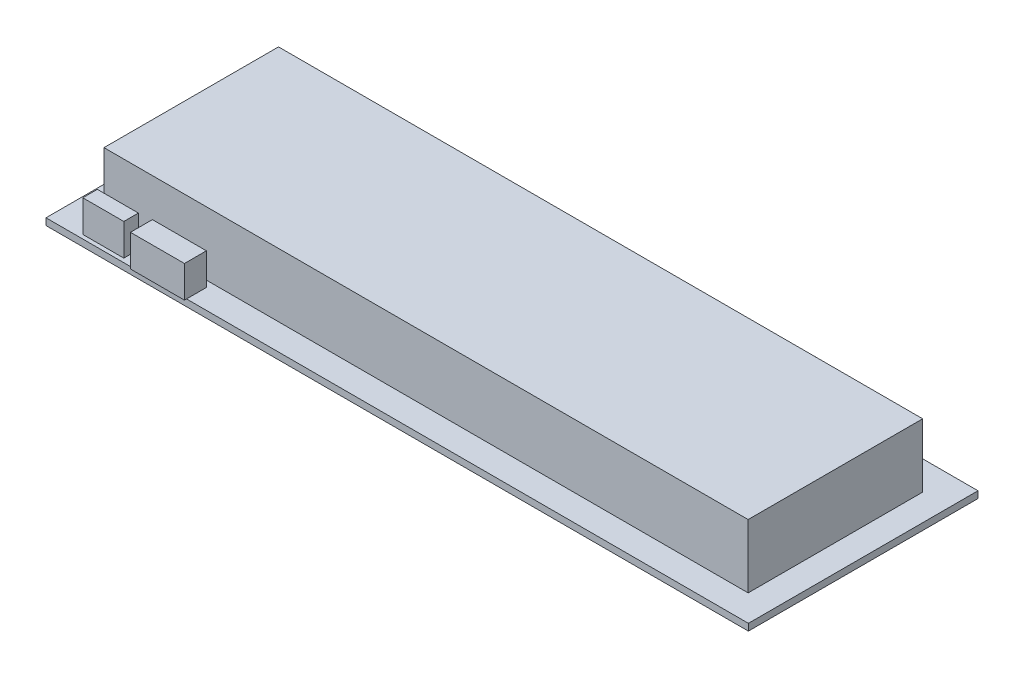
ISO-10303-21;
HEADER;
FILE_DESCRIPTION(('STEP AP214'),'2;1');
FILE_NAME('part.step','',(''),(''),'','','');
FILE_SCHEMA(('AUTOMOTIVE_DESIGN { 1 0 10303 214 1 1 1 1 }'));
ENDSEC;
DATA;
#1=APPLICATION_CONTEXT('core data for automotive mechanical design processes');
#2=APPLICATION_PROTOCOL_DEFINITION('international standard','automotive_design',2000,#1);
#3=PRODUCT_CONTEXT('',#1,'mechanical');
#4=PRODUCT('Part','Part','',(#3));
#5=PRODUCT_RELATED_PRODUCT_CATEGORY('part','',(#4));
#6=PRODUCT_DEFINITION_FORMATION('','',#4);
#7=PRODUCT_DEFINITION_CONTEXT('part definition',#1,'design');
#8=PRODUCT_DEFINITION('design','',#6,#7);
#9=PRODUCT_DEFINITION_SHAPE('','',#8);
#10=(LENGTH_UNIT() NAMED_UNIT(*) SI_UNIT(.MILLI.,.METRE.));
#11=(NAMED_UNIT(*) PLANE_ANGLE_UNIT() SI_UNIT($,.RADIAN.));
#12=(NAMED_UNIT(*) SI_UNIT($,.STERADIAN.) SOLID_ANGLE_UNIT());
#13=UNCERTAINTY_MEASURE_WITH_UNIT(LENGTH_MEASURE(1.E-05),#10,'distance_accuracy_value','');
#14=(GEOMETRIC_REPRESENTATION_CONTEXT(3) GLOBAL_UNCERTAINTY_ASSIGNED_CONTEXT((#13)) GLOBAL_UNIT_ASSIGNED_CONTEXT((#10,
#11,#12)) REPRESENTATION_CONTEXT('',''));
#15=CARTESIAN_POINT('',(0.,0.,0.));
#16=DIRECTION('',(0.,0.,1.));
#17=DIRECTION('',(1.,0.,0.));
#18=AXIS2_PLACEMENT_3D('',#15,#16,#17);
#19=CARTESIAN_POINT('',(0.,2.56,0.));
#20=DIRECTION('',(0.,-1.,0.));
#21=DIRECTION('',(0.,0.,-1.));
#22=AXIS2_PLACEMENT_3D('',#19,#20,#21);
#23=PLANE('',#22);
#24=DIRECTION('',(0.,0.,1.));
#25=VECTOR('',#24,1.);
#26=CARTESIAN_POINT('',(12.4,2.56,-1.5));
#27=LINE('',#26,#25);
#28=CARTESIAN_POINT('',(12.4,2.56,-7.));
#29=VERTEX_POINT('',#28);
#30=CARTESIAN_POINT('',(12.4,2.56,-1.5));
#31=VERTEX_POINT('',#30);
#32=EDGE_CURVE('E176',#29,#31,#27,.T.);
#33=ORIENTED_EDGE('',*,*,#32,.F.);
#34=DIRECTION('',(-1.,0.,0.));
#35=VECTOR('',#34,1.);
#36=CARTESIAN_POINT('',(12.4,2.56,-7.));
#37=LINE('',#36,#35);
#38=CARTESIAN_POINT('',(27.9,2.56,-7.));
#39=VERTEX_POINT('',#38);
#40=EDGE_CURVE('E189',#39,#29,#37,.T.);
#41=ORIENTED_EDGE('',*,*,#40,.F.);
#42=DIRECTION('',(0.,0.,-1.));
#43=VECTOR('',#42,1.);
#44=CARTESIAN_POINT('',(27.9,2.56,-1.5));
#45=LINE('',#44,#43);
#46=CARTESIAN_POINT('',(27.9,2.56,-1.5));
#47=VERTEX_POINT('',#46);
#48=EDGE_CURVE('E198',#47,#39,#45,.T.);
#49=ORIENTED_EDGE('',*,*,#48,.F.);
#50=DIRECTION('',(1.,0.,0.));
#51=VECTOR('',#50,1.);
#52=CARTESIAN_POINT('',(12.4,2.56,-1.5));
#53=LINE('',#52,#51);
#54=EDGE_CURVE('E179',#31,#47,#53,.T.);
#55=ORIENTED_EDGE('',*,*,#54,.F.);
#56=EDGE_LOOP('',(#33,#41,#49,#55));
#57=FACE_BOUND('',#56,.T.);
#58=DIRECTION('',(0.,0.,1.));
#59=VECTOR('',#58,1.);
#60=CARTESIAN_POINT('',(12.,2.56,-9.9));
#61=LINE('',#60,#59);
#62=CARTESIAN_POINT('',(12.,2.56,-75.84));
#63=VERTEX_POINT('',#62);
#64=CARTESIAN_POINT('',(12.,2.56,-9.9));
#65=VERTEX_POINT('',#64);
#66=EDGE_CURVE('E214',#63,#65,#61,.T.);
#67=ORIENTED_EDGE('',*,*,#66,.F.);
#68=DIRECTION('',(-1.,0.,0.));
#69=VECTOR('',#68,1.);
#70=CARTESIAN_POINT('',(12.,2.56,-75.84));
#71=LINE('',#70,#69);
#72=CARTESIAN_POINT('',(255.36,2.56,-75.84));
#73=VERTEX_POINT('',#72);
#74=EDGE_CURVE('E219',#73,#63,#71,.T.);
#75=ORIENTED_EDGE('',*,*,#74,.F.);
#76=DIRECTION('',(0.,0.,-1.));
#77=VECTOR('',#76,1.);
#78=CARTESIAN_POINT('',(255.36,2.56,-9.9));
#79=LINE('',#78,#77);
#80=CARTESIAN_POINT('',(255.36,2.56,-9.9));
#81=VERTEX_POINT('',#80);
#82=EDGE_CURVE('E231',#81,#73,#79,.T.);
#83=ORIENTED_EDGE('',*,*,#82,.F.);
#84=DIRECTION('',(1.,0.,0.));
#85=VECTOR('',#84,1.);
#86=CARTESIAN_POINT('',(12.,2.56,-9.9));
#87=LINE('',#86,#85);
#88=EDGE_CURVE('E228',#65,#81,#87,.T.);
#89=ORIENTED_EDGE('',*,*,#88,.F.);
#90=EDGE_LOOP('',(#67,#75,#83,#89));
#91=FACE_BOUND('',#90,.T.);
#92=DIRECTION('',(0.,0.,1.));
#93=VECTOR('',#92,1.);
#94=CARTESIAN_POINT('',(32.7,2.56,-7.5));
#95=LINE('',#94,#93);
#96=CARTESIAN_POINT('',(32.7,2.56,-7.5));
#97=VERTEX_POINT('',#96);
#98=CARTESIAN_POINT('',(32.7,2.56,0.));
#99=VERTEX_POINT('',#98);
#100=EDGE_CURVE('E48',#97,#99,#95,.T.);
#101=ORIENTED_EDGE('',*,*,#100,.F.);
#102=DIRECTION('',(-1.,0.,0.));
#103=VECTOR('',#102,1.);
#104=CARTESIAN_POINT('',(32.7,2.56,-7.5));
#105=LINE('',#104,#103);
#106=CARTESIAN_POINT('',(53.1,2.56,-7.5));
#107=VERTEX_POINT('',#106);
#108=EDGE_CURVE('E52',#107,#97,#105,.T.);
#109=ORIENTED_EDGE('',*,*,#108,.F.);
#110=DIRECTION('',(0.,0.,-1.));
#111=VECTOR('',#110,1.);
#112=CARTESIAN_POINT('',(53.1,2.56,-7.5));
#113=LINE('',#112,#111);
#114=CARTESIAN_POINT('',(53.1,2.56,0.));
#115=VERTEX_POINT('',#114);
#116=EDGE_CURVE('E291',#115,#107,#113,.T.);
#117=ORIENTED_EDGE('',*,*,#116,.F.);
#118=DIRECTION('',(1.,0.,0.));
#119=VECTOR('',#118,1.);
#120=CARTESIAN_POINT('',(0.,2.56,0.));
#121=LINE('',#120,#119);
#122=CARTESIAN_POINT('',(265.36,2.56,0.));
#123=VERTEX_POINT('',#122);
#124=EDGE_CURVE('E251',#115,#123,#121,.T.);
#125=ORIENTED_EDGE('',*,*,#124,.T.);
#126=DIRECTION('',(0.,0.,-1.));
#127=VECTOR('',#126,1.);
#128=CARTESIAN_POINT('',(265.36,2.56,0.));
#129=LINE('',#128,#127);
#130=CARTESIAN_POINT('',(265.36,2.56,-86.74));
#131=VERTEX_POINT('',#130);
#132=EDGE_CURVE('E255',#123,#131,#129,.T.);
#133=ORIENTED_EDGE('',*,*,#132,.T.);
#134=DIRECTION('',(-1.,0.,0.));
#135=VECTOR('',#134,1.);
#136=CARTESIAN_POINT('',(0.,2.56,-86.74));
#137=LINE('',#136,#135);
#138=CARTESIAN_POINT('',(0.,2.56,-86.74));
#139=VERTEX_POINT('',#138);
#140=EDGE_CURVE('E258',#131,#139,#137,.T.);
#141=ORIENTED_EDGE('',*,*,#140,.T.);
#142=DIRECTION('',(0.,0.,1.));
#143=VECTOR('',#142,1.);
#144=CARTESIAN_POINT('',(0.,2.56,0.));
#145=LINE('',#144,#143);
#146=CARTESIAN_POINT('',(0.,2.56,0.));
#147=VERTEX_POINT('',#146);
#148=EDGE_CURVE('E248',#139,#147,#145,.T.);
#149=ORIENTED_EDGE('',*,*,#148,.T.);
#150=EDGE_CURVE('E253',#147,#99,#121,.T.);
#151=ORIENTED_EDGE('',*,*,#150,.T.);
#152=EDGE_LOOP('',(#101,#109,#117,#125,#133,#141,#149,#151));
#153=FACE_BOUND('',#152,.T.);
#154=ADVANCED_FACE('F33',(#57,#91,#153),#23,.F.);
#155=CARTESIAN_POINT('',(0.,2.56,0.));
#156=DIRECTION('',(1.,0.,0.));
#157=DIRECTION('',(0.,0.,-1.));
#158=AXIS2_PLACEMENT_3D('',#155,#156,#157);
#159=PLANE('',#158);
#160=DIRECTION('',(0.,0.,1.));
#161=VECTOR('',#160,1.);
#162=CARTESIAN_POINT('',(0.,0.,0.));
#163=LINE('',#162,#161);
#164=CARTESIAN_POINT('',(0.,0.,-86.74));
#165=VERTEX_POINT('',#164);
#166=CARTESIAN_POINT('',(0.,0.,0.));
#167=VERTEX_POINT('',#166);
#168=EDGE_CURVE('E247',#165,#167,#163,.T.);
#169=ORIENTED_EDGE('',*,*,#168,.T.);
#170=DIRECTION('',(0.,-1.,0.));
#171=VECTOR('',#170,1.);
#172=CARTESIAN_POINT('',(0.,2.56,0.));
#173=LINE('',#172,#171);
#174=EDGE_CURVE('E11',#147,#167,#173,.T.);
#175=ORIENTED_EDGE('',*,*,#174,.F.);
#176=ORIENTED_EDGE('',*,*,#148,.F.);
#177=DIRECTION('',(0.,-1.,0.));
#178=VECTOR('',#177,1.);
#179=CARTESIAN_POINT('',(0.,2.56,-86.74));
#180=LINE('',#179,#178);
#181=EDGE_CURVE('E260',#139,#165,#180,.T.);
#182=ORIENTED_EDGE('',*,*,#181,.T.);
#183=EDGE_LOOP('',(#169,#175,#176,#182));
#184=FACE_BOUND('',#183,.T.);
#185=ADVANCED_FACE('F35',(#184),#159,.F.);
#186=CARTESIAN_POINT('',(0.,2.56,0.));
#187=DIRECTION('',(0.,0.,-1.));
#188=DIRECTION('',(-1.,0.,0.));
#189=AXIS2_PLACEMENT_3D('',#186,#187,#188);
#190=PLANE('',#189);
#191=DIRECTION('',(1.,0.,0.));
#192=VECTOR('',#191,1.);
#193=CARTESIAN_POINT('',(0.,0.,0.));
#194=LINE('',#193,#192);
#195=CARTESIAN_POINT('',(265.36,0.,0.));
#196=VERTEX_POINT('',#195);
#197=EDGE_CURVE('E263',#167,#196,#194,.T.);
#198=ORIENTED_EDGE('',*,*,#197,.T.);
#199=DIRECTION('',(0.,-1.,0.));
#200=VECTOR('',#199,1.);
#201=CARTESIAN_POINT('',(265.36,2.56,0.));
#202=LINE('',#201,#200);
#203=EDGE_CURVE('E41',#123,#196,#202,.T.);
#204=ORIENTED_EDGE('',*,*,#203,.F.);
#205=ORIENTED_EDGE('',*,*,#124,.F.);
#206=EDGE_CURVE('E256',#99,#115,#121,.T.);
#207=ORIENTED_EDGE('',*,*,#206,.F.);
#208=ORIENTED_EDGE('',*,*,#150,.F.);
#209=ORIENTED_EDGE('',*,*,#174,.T.);
#210=EDGE_LOOP('',(#198,#204,#205,#207,#208,#209));
#211=FACE_BOUND('',#210,.T.);
#212=ADVANCED_FACE('F328',(#211),#190,.F.);
#213=CARTESIAN_POINT('',(265.36,2.56,0.));
#214=DIRECTION('',(-1.,0.,0.));
#215=DIRECTION('',(0.,0.,1.));
#216=AXIS2_PLACEMENT_3D('',#213,#214,#215);
#217=PLANE('',#216);
#218=DIRECTION('',(0.,0.,-1.));
#219=VECTOR('',#218,1.);
#220=CARTESIAN_POINT('',(265.36,0.,0.));
#221=LINE('',#220,#219);
#222=CARTESIAN_POINT('',(265.36,0.,-86.74));
#223=VERTEX_POINT('',#222);
#224=EDGE_CURVE('E265',#196,#223,#221,.T.);
#225=ORIENTED_EDGE('',*,*,#224,.T.);
#226=DIRECTION('',(0.,-1.,0.));
#227=VECTOR('',#226,1.);
#228=CARTESIAN_POINT('',(265.36,2.56,-86.74));
#229=LINE('',#228,#227);
#230=EDGE_CURVE('E270',#131,#223,#229,.T.);
#231=ORIENTED_EDGE('',*,*,#230,.F.);
#232=ORIENTED_EDGE('',*,*,#132,.F.);
#233=ORIENTED_EDGE('',*,*,#203,.T.);
#234=EDGE_LOOP('',(#225,#231,#232,#233));
#235=FACE_BOUND('',#234,.T.);
#236=ADVANCED_FACE('F277',(#235),#217,.F.);
#237=CARTESIAN_POINT('',(0.,2.56,-86.74));
#238=DIRECTION('',(0.,0.,1.));
#239=DIRECTION('',(1.,0.,0.));
#240=AXIS2_PLACEMENT_3D('',#237,#238,#239);
#241=PLANE('',#240);
#242=DIRECTION('',(-1.,0.,0.));
#243=VECTOR('',#242,1.);
#244=CARTESIAN_POINT('',(0.,0.,-86.74));
#245=LINE('',#244,#243);
#246=EDGE_CURVE('E252',#223,#165,#245,.T.);
#247=ORIENTED_EDGE('',*,*,#246,.T.);
#248=ORIENTED_EDGE('',*,*,#181,.F.);
#249=ORIENTED_EDGE('',*,*,#140,.F.);
#250=ORIENTED_EDGE('',*,*,#230,.T.);
#251=EDGE_LOOP('',(#247,#248,#249,#250));
#252=FACE_BOUND('',#251,.T.);
#253=ADVANCED_FACE('F286',(#252),#241,.F.);
#254=CARTESIAN_POINT('',(0.,0.,0.));
#255=DIRECTION('',(0.,-1.,0.));
#256=DIRECTION('',(0.,0.,-1.));
#257=AXIS2_PLACEMENT_3D('',#254,#255,#256);
#258=PLANE('',#257);
#259=ORIENTED_EDGE('',*,*,#168,.F.);
#260=ORIENTED_EDGE('',*,*,#246,.F.);
#261=ORIENTED_EDGE('',*,*,#224,.F.);
#262=ORIENTED_EDGE('',*,*,#197,.F.);
#263=EDGE_LOOP('',(#259,#260,#261,#262));
#264=FACE_BOUND('',#263,.T.);
#265=ADVANCED_FACE('F283',(#264),#258,.T.);
#266=CARTESIAN_POINT('',(12.,26.56,-9.9));
#267=DIRECTION('',(1.,0.,0.));
#268=DIRECTION('',(0.,0.,-1.));
#269=AXIS2_PLACEMENT_3D('',#266,#267,#268);
#270=PLANE('',#269);
#271=ORIENTED_EDGE('',*,*,#66,.T.);
#272=DIRECTION('',(0.,-1.,0.));
#273=VECTOR('',#272,1.);
#274=CARTESIAN_POINT('',(12.,26.56,-9.9));
#275=LINE('',#274,#273);
#276=CARTESIAN_POINT('',(12.,26.56,-9.9));
#277=VERTEX_POINT('',#276);
#278=EDGE_CURVE('E244',#277,#65,#275,.T.);
#279=ORIENTED_EDGE('',*,*,#278,.F.);
#280=DIRECTION('',(0.,0.,1.));
#281=VECTOR('',#280,1.);
#282=CARTESIAN_POINT('',(12.,26.56,-9.9));
#283=LINE('',#282,#281);
#284=CARTESIAN_POINT('',(12.,26.56,-75.84));
#285=VERTEX_POINT('',#284);
#286=EDGE_CURVE('E215',#285,#277,#283,.T.);
#287=ORIENTED_EDGE('',*,*,#286,.F.);
#288=DIRECTION('',(0.,-1.,0.));
#289=VECTOR('',#288,1.);
#290=CARTESIAN_POINT('',(12.,26.56,-75.84));
#291=LINE('',#290,#289);
#292=EDGE_CURVE('E225',#285,#63,#291,.T.);
#293=ORIENTED_EDGE('',*,*,#292,.T.);
#294=EDGE_LOOP('',(#271,#279,#287,#293));
#295=FACE_BOUND('',#294,.T.);
#296=ADVANCED_FACE('F332',(#295),#270,.F.);
#297=CARTESIAN_POINT('',(12.,26.56,-9.9));
#298=DIRECTION('',(0.,0.,-1.));
#299=DIRECTION('',(-1.,0.,0.));
#300=AXIS2_PLACEMENT_3D('',#297,#298,#299);
#301=PLANE('',#300);
#302=ORIENTED_EDGE('',*,*,#88,.T.);
#303=DIRECTION('',(0.,-1.,0.));
#304=VECTOR('',#303,1.);
#305=CARTESIAN_POINT('',(255.36,26.56,-9.9));
#306=LINE('',#305,#304);
#307=CARTESIAN_POINT('',(255.36,26.56,-9.9));
#308=VERTEX_POINT('',#307);
#309=EDGE_CURVE('E241',#308,#81,#306,.T.);
#310=ORIENTED_EDGE('',*,*,#309,.F.);
#311=DIRECTION('',(1.,0.,0.));
#312=VECTOR('',#311,1.);
#313=CARTESIAN_POINT('',(12.,26.56,-9.9));
#314=LINE('',#313,#312);
#315=EDGE_CURVE('E218',#277,#308,#314,.T.);
#316=ORIENTED_EDGE('',*,*,#315,.F.);
#317=ORIENTED_EDGE('',*,*,#278,.T.);
#318=EDGE_LOOP('',(#302,#310,#316,#317));
#319=FACE_BOUND('',#318,.T.);
#320=ADVANCED_FACE('F363',(#319),#301,.F.);
#321=CARTESIAN_POINT('',(255.36,26.56,-9.9));
#322=DIRECTION('',(-1.,0.,0.));
#323=DIRECTION('',(0.,0.,1.));
#324=AXIS2_PLACEMENT_3D('',#321,#322,#323);
#325=PLANE('',#324);
#326=ORIENTED_EDGE('',*,*,#82,.T.);
#327=DIRECTION('',(0.,-1.,0.));
#328=VECTOR('',#327,1.);
#329=CARTESIAN_POINT('',(255.36,26.56,-75.84));
#330=LINE('',#329,#328);
#331=CARTESIAN_POINT('',(255.36,26.56,-75.84));
#332=VERTEX_POINT('',#331);
#333=EDGE_CURVE('E238',#332,#73,#330,.T.);
#334=ORIENTED_EDGE('',*,*,#333,.F.);
#335=DIRECTION('',(0.,0.,-1.));
#336=VECTOR('',#335,1.);
#337=CARTESIAN_POINT('',(255.36,26.56,-9.9));
#338=LINE('',#337,#336);
#339=EDGE_CURVE('E221',#308,#332,#338,.T.);
#340=ORIENTED_EDGE('',*,*,#339,.F.);
#341=ORIENTED_EDGE('',*,*,#309,.T.);
#342=EDGE_LOOP('',(#326,#334,#340,#341));
#343=FACE_BOUND('',#342,.T.);
#344=ADVANCED_FACE('F370',(#343),#325,.F.);
#345=CARTESIAN_POINT('',(12.,26.56,-75.84));
#346=DIRECTION('',(0.,0.,1.));
#347=DIRECTION('',(1.,0.,0.));
#348=AXIS2_PLACEMENT_3D('',#345,#346,#347);
#349=PLANE('',#348);
#350=ORIENTED_EDGE('',*,*,#74,.T.);
#351=ORIENTED_EDGE('',*,*,#292,.F.);
#352=DIRECTION('',(-1.,0.,0.));
#353=VECTOR('',#352,1.);
#354=CARTESIAN_POINT('',(12.,26.56,-75.84));
#355=LINE('',#354,#353);
#356=EDGE_CURVE('E223',#332,#285,#355,.T.);
#357=ORIENTED_EDGE('',*,*,#356,.F.);
#358=ORIENTED_EDGE('',*,*,#333,.T.);
#359=EDGE_LOOP('',(#350,#351,#357,#358));
#360=FACE_BOUND('',#359,.T.);
#361=ADVANCED_FACE('F377',(#360),#349,.F.);
#362=CARTESIAN_POINT('',(0.,26.56,0.));
#363=DIRECTION('',(0.,-1.,0.));
#364=DIRECTION('',(0.,0.,-1.));
#365=AXIS2_PLACEMENT_3D('',#362,#363,#364);
#366=PLANE('',#365);
#367=ORIENTED_EDGE('',*,*,#286,.T.);
#368=ORIENTED_EDGE('',*,*,#315,.T.);
#369=ORIENTED_EDGE('',*,*,#339,.T.);
#370=ORIENTED_EDGE('',*,*,#356,.T.);
#371=EDGE_LOOP('',(#367,#368,#369,#370));
#372=FACE_BOUND('',#371,.T.);
#373=ADVANCED_FACE('F385',(#372),#366,.F.);
#374=CARTESIAN_POINT('',(12.4,14.56,-1.5));
#375=DIRECTION('',(1.,0.,0.));
#376=DIRECTION('',(0.,0.,-1.));
#377=AXIS2_PLACEMENT_3D('',#374,#375,#376);
#378=PLANE('',#377);
#379=ORIENTED_EDGE('',*,*,#32,.T.);
#380=DIRECTION('',(0.,-1.,0.));
#381=VECTOR('',#380,1.);
#382=CARTESIAN_POINT('',(12.4,14.56,-1.5));
#383=LINE('',#382,#381);
#384=CARTESIAN_POINT('',(12.4,14.56,-1.5));
#385=VERTEX_POINT('',#384);
#386=EDGE_CURVE('E211',#385,#31,#383,.T.);
#387=ORIENTED_EDGE('',*,*,#386,.F.);
#388=DIRECTION('',(0.,0.,1.));
#389=VECTOR('',#388,1.);
#390=CARTESIAN_POINT('',(12.4,14.56,-1.5));
#391=LINE('',#390,#389);
#392=CARTESIAN_POINT('',(12.4,14.56,-7.));
#393=VERTEX_POINT('',#392);
#394=EDGE_CURVE('E185',#393,#385,#391,.T.);
#395=ORIENTED_EDGE('',*,*,#394,.F.);
#396=DIRECTION('',(0.,-1.,0.));
#397=VECTOR('',#396,1.);
#398=CARTESIAN_POINT('',(12.4,14.56,-7.));
#399=LINE('',#398,#397);
#400=EDGE_CURVE('E194',#393,#29,#399,.T.);
#401=ORIENTED_EDGE('',*,*,#400,.T.);
#402=EDGE_LOOP('',(#379,#387,#395,#401));
#403=FACE_BOUND('',#402,.T.);
#404=ADVANCED_FACE('F393',(#403),#378,.F.);
#405=CARTESIAN_POINT('',(12.4,14.56,-1.5));
#406=DIRECTION('',(0.,0.,-1.));
#407=DIRECTION('',(-1.,0.,0.));
#408=AXIS2_PLACEMENT_3D('',#405,#406,#407);
#409=PLANE('',#408);
#410=ORIENTED_EDGE('',*,*,#54,.T.);
#411=DIRECTION('',(0.,-1.,0.));
#412=VECTOR('',#411,1.);
#413=CARTESIAN_POINT('',(27.9,14.56,-1.5));
#414=LINE('',#413,#412);
#415=CARTESIAN_POINT('',(27.9,14.56,-1.5));
#416=VERTEX_POINT('',#415);
#417=EDGE_CURVE('E208',#416,#47,#414,.T.);
#418=ORIENTED_EDGE('',*,*,#417,.F.);
#419=DIRECTION('',(1.,0.,0.));
#420=VECTOR('',#419,1.);
#421=CARTESIAN_POINT('',(12.4,14.56,-1.5));
#422=LINE('',#421,#420);
#423=EDGE_CURVE('E188',#385,#416,#422,.T.);
#424=ORIENTED_EDGE('',*,*,#423,.F.);
#425=ORIENTED_EDGE('',*,*,#386,.T.);
#426=EDGE_LOOP('',(#410,#418,#424,#425));
#427=FACE_BOUND('',#426,.T.);
#428=ADVANCED_FACE('F400',(#427),#409,.F.);
#429=CARTESIAN_POINT('',(27.9,14.56,-1.5));
#430=DIRECTION('',(-1.,0.,0.));
#431=DIRECTION('',(0.,0.,1.));
#432=AXIS2_PLACEMENT_3D('',#429,#430,#431);
#433=PLANE('',#432);
#434=ORIENTED_EDGE('',*,*,#48,.T.);
#435=DIRECTION('',(0.,-1.,0.));
#436=VECTOR('',#435,1.);
#437=CARTESIAN_POINT('',(27.9,14.56,-7.));
#438=LINE('',#437,#436);
#439=CARTESIAN_POINT('',(27.9,14.56,-7.));
#440=VERTEX_POINT('',#439);
#441=EDGE_CURVE('E205',#440,#39,#438,.T.);
#442=ORIENTED_EDGE('',*,*,#441,.F.);
#443=DIRECTION('',(0.,0.,-1.));
#444=VECTOR('',#443,1.);
#445=CARTESIAN_POINT('',(27.9,14.56,-1.5));
#446=LINE('',#445,#444);
#447=EDGE_CURVE('E191',#416,#440,#446,.T.);
#448=ORIENTED_EDGE('',*,*,#447,.F.);
#449=ORIENTED_EDGE('',*,*,#417,.T.);
#450=EDGE_LOOP('',(#434,#442,#448,#449));
#451=FACE_BOUND('',#450,.T.);
#452=ADVANCED_FACE('F408',(#451),#433,.F.);
#453=CARTESIAN_POINT('',(12.4,14.56,-7.));
#454=DIRECTION('',(0.,0.,1.));
#455=DIRECTION('',(1.,0.,0.));
#456=AXIS2_PLACEMENT_3D('',#453,#454,#455);
#457=PLANE('',#456);
#458=ORIENTED_EDGE('',*,*,#40,.T.);
#459=ORIENTED_EDGE('',*,*,#400,.F.);
#460=DIRECTION('',(-1.,0.,0.));
#461=VECTOR('',#460,1.);
#462=CARTESIAN_POINT('',(12.4,14.56,-7.));
#463=LINE('',#462,#461);
#464=EDGE_CURVE('E193',#440,#393,#463,.T.);
#465=ORIENTED_EDGE('',*,*,#464,.F.);
#466=ORIENTED_EDGE('',*,*,#441,.T.);
#467=EDGE_LOOP('',(#458,#459,#465,#466));
#468=FACE_BOUND('',#467,.T.);
#469=ADVANCED_FACE('F416',(#468),#457,.F.);
#470=CARTESIAN_POINT('',(0.,14.56,0.));
#471=DIRECTION('',(0.,-1.,0.));
#472=DIRECTION('',(0.,0.,-1.));
#473=AXIS2_PLACEMENT_3D('',#470,#471,#472);
#474=PLANE('',#473);
#475=ORIENTED_EDGE('',*,*,#394,.T.);
#476=ORIENTED_EDGE('',*,*,#423,.T.);
#477=ORIENTED_EDGE('',*,*,#447,.T.);
#478=ORIENTED_EDGE('',*,*,#464,.T.);
#479=EDGE_LOOP('',(#475,#476,#477,#478));
#480=FACE_BOUND('',#479,.T.);
#481=ADVANCED_FACE('F424',(#480),#474,.F.);
#482=CARTESIAN_POINT('',(0.,2.56,0.));
#483=DIRECTION('',(0.,1.,0.));
#484=DIRECTION('',(0.,0.,1.));
#485=AXIS2_PLACEMENT_3D('',#482,#483,#484);
#486=PLANE('',#485);
#487=CARTESIAN_POINT('',(32.7,2.56,0.8));
#488=VERTEX_POINT('',#487);
#489=EDGE_CURVE('E174',#99,#488,#95,.T.);
#490=ORIENTED_EDGE('',*,*,#489,.F.);
#491=ORIENTED_EDGE('',*,*,#206,.T.);
#492=CARTESIAN_POINT('',(53.1,2.56,0.8));
#493=VERTEX_POINT('',#492);
#494=EDGE_CURVE('E297',#493,#115,#113,.T.);
#495=ORIENTED_EDGE('',*,*,#494,.F.);
#496=DIRECTION('',(1.,0.,0.));
#497=VECTOR('',#496,1.);
#498=CARTESIAN_POINT('',(32.7,2.56,0.8));
#499=LINE('',#498,#497);
#500=EDGE_CURVE('E304',#488,#493,#499,.T.);
#501=ORIENTED_EDGE('',*,*,#500,.F.);
#502=EDGE_LOOP('',(#490,#491,#495,#501));
#503=FACE_BOUND('',#502,.T.);
#504=ADVANCED_FACE('F296',(#503),#486,.F.);
#505=CARTESIAN_POINT('',(32.7,14.56,-7.5));
#506=DIRECTION('',(1.,0.,0.));
#507=DIRECTION('',(0.,0.,-1.));
#508=AXIS2_PLACEMENT_3D('',#505,#506,#507);
#509=PLANE('',#508);
#510=ORIENTED_EDGE('',*,*,#100,.T.);
#511=ORIENTED_EDGE('',*,*,#489,.T.);
#512=DIRECTION('',(0.,-1.,0.));
#513=VECTOR('',#512,1.);
#514=CARTESIAN_POINT('',(32.7,14.56,0.8));
#515=LINE('',#514,#513);
#516=CARTESIAN_POINT('',(32.7,14.56,0.8));
#517=VERTEX_POINT('',#516);
#518=EDGE_CURVE('E156',#517,#488,#515,.T.);
#519=ORIENTED_EDGE('',*,*,#518,.F.);
#520=DIRECTION('',(0.,0.,1.));
#521=VECTOR('',#520,1.);
#522=CARTESIAN_POINT('',(32.7,14.56,-7.5));
#523=LINE('',#522,#521);
#524=CARTESIAN_POINT('',(32.7,14.56,-7.5));
#525=VERTEX_POINT('',#524);
#526=EDGE_CURVE('E162',#525,#517,#523,.T.);
#527=ORIENTED_EDGE('',*,*,#526,.F.);
#528=DIRECTION('',(0.,-1.,0.));
#529=VECTOR('',#528,1.);
#530=CARTESIAN_POINT('',(32.7,14.56,-7.5));
#531=LINE('',#530,#529);
#532=EDGE_CURVE('E308',#525,#97,#531,.T.);
#533=ORIENTED_EDGE('',*,*,#532,.T.);
#534=EDGE_LOOP('',(#510,#511,#519,#527,#533));
#535=FACE_BOUND('',#534,.T.);
#536=ADVANCED_FACE('F172',(#535),#509,.F.);
#537=CARTESIAN_POINT('',(32.7,14.56,0.8));
#538=DIRECTION('',(0.,0.,-1.));
#539=DIRECTION('',(-1.,0.,0.));
#540=AXIS2_PLACEMENT_3D('',#537,#538,#539);
#541=PLANE('',#540);
#542=ORIENTED_EDGE('',*,*,#500,.T.);
#543=DIRECTION('',(0.,-1.,0.));
#544=VECTOR('',#543,1.);
#545=CARTESIAN_POINT('',(53.1,14.56,0.8));
#546=LINE('',#545,#544);
#547=CARTESIAN_POINT('',(53.1,14.56,0.8));
#548=VERTEX_POINT('',#547);
#549=EDGE_CURVE('E158',#548,#493,#546,.T.);
#550=ORIENTED_EDGE('',*,*,#549,.F.);
#551=DIRECTION('',(1.,0.,0.));
#552=VECTOR('',#551,1.);
#553=CARTESIAN_POINT('',(32.7,14.56,0.8));
#554=LINE('',#553,#552);
#555=EDGE_CURVE('E152',#517,#548,#554,.T.);
#556=ORIENTED_EDGE('',*,*,#555,.F.);
#557=ORIENTED_EDGE('',*,*,#518,.T.);
#558=EDGE_LOOP('',(#542,#550,#556,#557));
#559=FACE_BOUND('',#558,.T.);
#560=ADVANCED_FACE('F154',(#559),#541,.F.);
#561=CARTESIAN_POINT('',(53.1,14.56,-7.5));
#562=DIRECTION('',(-1.,0.,0.));
#563=DIRECTION('',(0.,0.,1.));
#564=AXIS2_PLACEMENT_3D('',#561,#562,#563);
#565=PLANE('',#564);
#566=ORIENTED_EDGE('',*,*,#494,.T.);
#567=ORIENTED_EDGE('',*,*,#116,.T.);
#568=DIRECTION('',(0.,-1.,0.));
#569=VECTOR('',#568,1.);
#570=CARTESIAN_POINT('',(53.1,14.56,-7.5));
#571=LINE('',#570,#569);
#572=CARTESIAN_POINT('',(53.1,14.56,-7.5));
#573=VERTEX_POINT('',#572);
#574=EDGE_CURVE('E181',#573,#107,#571,.T.);
#575=ORIENTED_EDGE('',*,*,#574,.F.);
#576=DIRECTION('',(0.,0.,-1.));
#577=VECTOR('',#576,1.);
#578=CARTESIAN_POINT('',(53.1,14.56,-7.5));
#579=LINE('',#578,#577);
#580=EDGE_CURVE('E161',#548,#573,#579,.T.);
#581=ORIENTED_EDGE('',*,*,#580,.F.);
#582=ORIENTED_EDGE('',*,*,#549,.T.);
#583=EDGE_LOOP('',(#566,#567,#575,#581,#582));
#584=FACE_BOUND('',#583,.T.);
#585=ADVANCED_FACE('F299',(#584),#565,.F.);
#586=CARTESIAN_POINT('',(32.7,14.56,-7.5));
#587=DIRECTION('',(0.,0.,1.));
#588=DIRECTION('',(1.,0.,0.));
#589=AXIS2_PLACEMENT_3D('',#586,#587,#588);
#590=PLANE('',#589);
#591=ORIENTED_EDGE('',*,*,#108,.T.);
#592=ORIENTED_EDGE('',*,*,#532,.F.);
#593=DIRECTION('',(-1.,0.,0.));
#594=VECTOR('',#593,1.);
#595=CARTESIAN_POINT('',(32.7,14.56,-7.5));
#596=LINE('',#595,#594);
#597=EDGE_CURVE('E167',#573,#525,#596,.T.);
#598=ORIENTED_EDGE('',*,*,#597,.F.);
#599=ORIENTED_EDGE('',*,*,#574,.T.);
#600=EDGE_LOOP('',(#591,#592,#598,#599));
#601=FACE_BOUND('',#600,.T.);
#602=ADVANCED_FACE('F310',(#601),#590,.F.);
#603=CARTESIAN_POINT('',(0.,14.56,0.));
#604=DIRECTION('',(0.,1.,0.));
#605=DIRECTION('',(0.,0.,1.));
#606=AXIS2_PLACEMENT_3D('',#603,#604,#605);
#607=PLANE('',#606);
#608=ORIENTED_EDGE('',*,*,#526,.T.);
#609=ORIENTED_EDGE('',*,*,#555,.T.);
#610=ORIENTED_EDGE('',*,*,#580,.T.);
#611=ORIENTED_EDGE('',*,*,#597,.T.);
#612=EDGE_LOOP('',(#608,#609,#610,#611));
#613=FACE_BOUND('',#612,.T.);
#614=ADVANCED_FACE('F165',(#613),#607,.T.);
#615=CLOSED_SHELL('',(#154,#185,#212,#236,#253,#265,#296,#320,#344,#361,#373,#404,#428,#452,
#469,#481,#504,#536,#560,#585,#602,#614));
#616=MANIFOLD_SOLID_BREP('B2',#615);
#617=ADVANCED_BREP_SHAPE_REPRESENTATION('',(#18,#616),#14);
#618=SHAPE_DEFINITION_REPRESENTATION(#9,#617);
ENDSEC;
END-ISO-10303-21;
